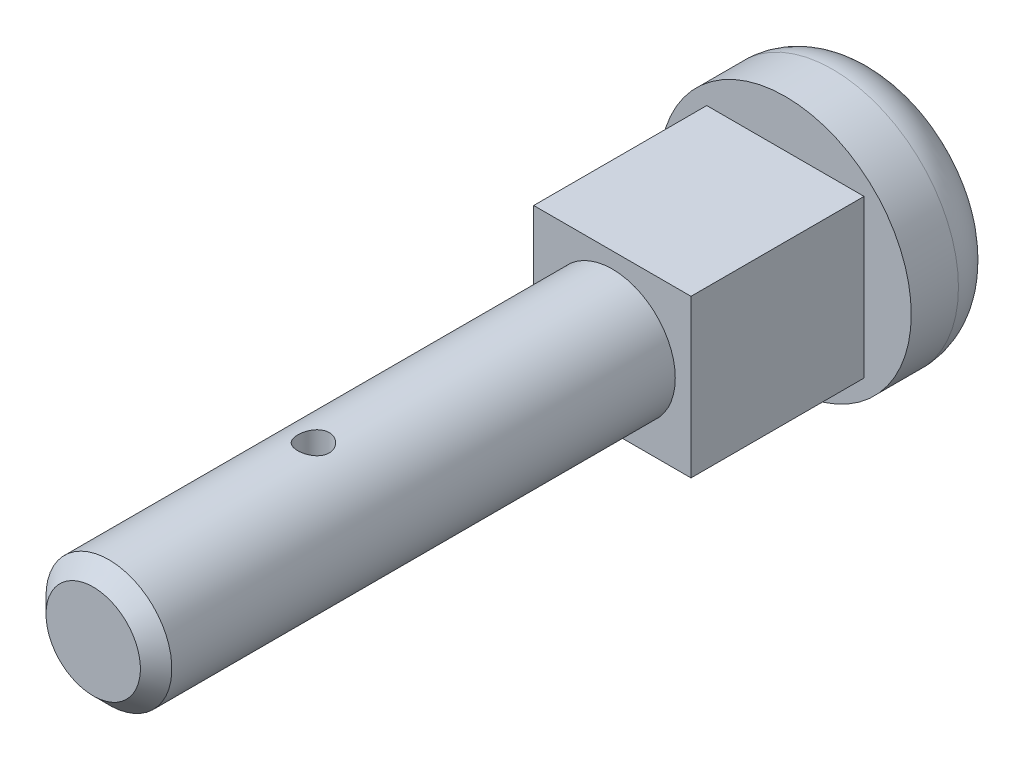
ISO-10303-21;
HEADER;
FILE_DESCRIPTION(('STEP AP214'),'2;1');
FILE_NAME('part.step','',(''),(''),'','','');
FILE_SCHEMA(('AUTOMOTIVE_DESIGN { 1 0 10303 214 1 1 1 1 }'));
ENDSEC;
DATA;
#1=APPLICATION_CONTEXT('core data for automotive mechanical design processes');
#2=APPLICATION_PROTOCOL_DEFINITION('international standard','automotive_design',2000,#1);
#3=PRODUCT_CONTEXT('',#1,'mechanical');
#4=PRODUCT('Part','Part','',(#3));
#5=PRODUCT_RELATED_PRODUCT_CATEGORY('part','',(#4));
#6=PRODUCT_DEFINITION_FORMATION('','',#4);
#7=PRODUCT_DEFINITION_CONTEXT('part definition',#1,'design');
#8=PRODUCT_DEFINITION('design','',#6,#7);
#9=PRODUCT_DEFINITION_SHAPE('','',#8);
#10=(LENGTH_UNIT() NAMED_UNIT(*) SI_UNIT(.MILLI.,.METRE.));
#11=(NAMED_UNIT(*) PLANE_ANGLE_UNIT() SI_UNIT($,.RADIAN.));
#12=(NAMED_UNIT(*) SI_UNIT($,.STERADIAN.) SOLID_ANGLE_UNIT());
#13=UNCERTAINTY_MEASURE_WITH_UNIT(LENGTH_MEASURE(1.E-05),#10,'distance_accuracy_value','');
#14=(GEOMETRIC_REPRESENTATION_CONTEXT(3) GLOBAL_UNCERTAINTY_ASSIGNED_CONTEXT((#13)) GLOBAL_UNIT_ASSIGNED_CONTEXT((#10,
#11,#12)) REPRESENTATION_CONTEXT('',''));
#15=CARTESIAN_POINT('',(0.,0.,0.));
#16=DIRECTION('',(0.,0.,1.));
#17=DIRECTION('',(1.,0.,0.));
#18=AXIS2_PLACEMENT_3D('',#15,#16,#17);
#19=CARTESIAN_POINT('',(0.,0.,-5.99999999999954));
#20=DIRECTION('',(0.,0.,0.999999999999971));
#21=DIRECTION('',(1.,0.,0.));
#22=AXIS2_PLACEMENT_3D('',#19,#20,#21);
#23=CYLINDRICAL_SURFACE('',#22,8.);
#24=CARTESIAN_POINT('',(0.,0.,-2.99999999999977));
#25=DIRECTION('',(0.,0.,0.999999999999971));
#26=DIRECTION('',(1.,0.,0.));
#27=AXIS2_PLACEMENT_3D('',#24,#25,#26);
#28=CIRCLE('',#27,8.);
#29=CARTESIAN_POINT('',(8.00000000000001,0.,-2.99999999999977));
#30=VERTEX_POINT('',#29);
#31=EDGE_CURVE('E186',#30,#30,#28,.T.);
#32=CARTESIAN_POINT('',(0.,0.,0.));
#33=DIRECTION('',(0.,0.,0.999999999999971));
#34=DIRECTION('',(1.,0.,0.));
#35=AXIS2_PLACEMENT_3D('',#32,#33,#34);
#36=CIRCLE('',#35,8.);
#37=CARTESIAN_POINT('',(8.00000000000001,0.,0.));
#38=VERTEX_POINT('',#37);
#39=EDGE_CURVE('E115',#38,#38,#36,.T.);
#40=CARTESIAN_POINT('',(8.00000000000001,0.,-2.99999999999977));
#41=CARTESIAN_POINT('',(8.00000000000001,0.,-2.96874999999977));
#42=CARTESIAN_POINT('',(8.00000000000001,0.,-2.93749999999978));
#43=CARTESIAN_POINT('',(8.00000000000001,0.,-2.87499999999978));
#44=CARTESIAN_POINT('',(8.00000000000001,0.,-2.84374999999978));
#45=CARTESIAN_POINT('',(8.00000000000001,0.,-2.78124999999979));
#46=CARTESIAN_POINT('',(8.00000000000001,0.,-2.74999999999979));
#47=CARTESIAN_POINT('',(8.00000000000001,0.,-2.68749999999979));
#48=CARTESIAN_POINT('',(8.00000000000001,0.,-2.6562499999998));
#49=CARTESIAN_POINT('',(8.00000000000001,0.,-2.5937499999998));
#50=CARTESIAN_POINT('',(8.00000000000001,0.,-2.5624999999998));
#51=CARTESIAN_POINT('',(8.00000000000001,0.,-2.49999999999981));
#52=CARTESIAN_POINT('',(8.00000000000001,0.,-2.46874999999981));
#53=CARTESIAN_POINT('',(8.00000000000001,0.,-2.40624999999982));
#54=CARTESIAN_POINT('',(8.00000000000001,0.,-2.37499999999982));
#55=CARTESIAN_POINT('',(8.00000000000001,0.,-2.31249999999982));
#56=CARTESIAN_POINT('',(8.00000000000001,0.,-2.28124999999983));
#57=CARTESIAN_POINT('',(8.00000000000001,0.,-2.21874999999983));
#58=CARTESIAN_POINT('',(8.00000000000001,0.,-2.18749999999983));
#59=CARTESIAN_POINT('',(8.00000000000001,0.,-2.12499999999984));
#60=CARTESIAN_POINT('',(8.00000000000001,0.,-2.09374999999984));
#61=CARTESIAN_POINT('',(8.00000000000001,0.,-2.03124999999984));
#62=CARTESIAN_POINT('',(8.00000000000001,0.,-1.99999999999985));
#63=CARTESIAN_POINT('',(8.00000000000001,0.,-1.93749999999985));
#64=CARTESIAN_POINT('',(8.00000000000001,0.,-1.90624999999985));
#65=CARTESIAN_POINT('',(8.00000000000001,0.,-1.84374999999986));
#66=CARTESIAN_POINT('',(8.00000000000001,0.,-1.81249999999986));
#67=CARTESIAN_POINT('',(8.00000000000001,0.,-1.74999999999987));
#68=CARTESIAN_POINT('',(8.00000000000001,0.,-1.71874999999987));
#69=CARTESIAN_POINT('',(8.00000000000001,0.,-1.65624999999987));
#70=CARTESIAN_POINT('',(8.00000000000001,0.,-1.62499999999988));
#71=CARTESIAN_POINT('',(8.00000000000001,0.,-1.56249999999988));
#72=CARTESIAN_POINT('',(8.00000000000001,0.,-1.53124999999988));
#73=CARTESIAN_POINT('',(8.00000000000001,0.,-1.46874999999989));
#74=CARTESIAN_POINT('',(8.00000000000001,0.,-1.43749999999989));
#75=CARTESIAN_POINT('',(8.00000000000001,0.,-1.3749999999999));
#76=CARTESIAN_POINT('',(8.00000000000001,0.,-1.3437499999999));
#77=CARTESIAN_POINT('',(8.00000000000001,0.,-1.2812499999999));
#78=CARTESIAN_POINT('',(8.00000000000001,0.,-1.2499999999999));
#79=CARTESIAN_POINT('',(8.00000000000001,0.,-1.18749999999991));
#80=CARTESIAN_POINT('',(8.00000000000001,0.,-1.15624999999991));
#81=CARTESIAN_POINT('',(8.00000000000001,0.,-1.09374999999992));
#82=CARTESIAN_POINT('',(8.00000000000001,0.,-1.06249999999992));
#83=CARTESIAN_POINT('',(8.00000000000001,0.,-0.999999999999924));
#84=CARTESIAN_POINT('',(8.00000000000001,0.,-0.968749999999926));
#85=CARTESIAN_POINT('',(8.00000000000001,0.,-0.906249999999931));
#86=CARTESIAN_POINT('',(8.00000000000001,0.,-0.874999999999933));
#87=CARTESIAN_POINT('',(8.00000000000001,0.,-0.812499999999938));
#88=CARTESIAN_POINT('',(8.00000000000001,0.,-0.78124999999994));
#89=CARTESIAN_POINT('',(8.00000000000001,0.,-0.718749999999945));
#90=CARTESIAN_POINT('',(8.00000000000001,0.,-0.687499999999948));
#91=CARTESIAN_POINT('',(8.00000000000001,0.,-0.624999999999953));
#92=CARTESIAN_POINT('',(8.00000000000001,0.,-0.593749999999955));
#93=CARTESIAN_POINT('',(8.00000000000001,0.,-0.53124999999996));
#94=CARTESIAN_POINT('',(8.00000000000001,0.,-0.499999999999962));
#95=CARTESIAN_POINT('',(8.00000000000001,0.,-0.437499999999967));
#96=CARTESIAN_POINT('',(8.00000000000001,0.,-0.406249999999969));
#97=CARTESIAN_POINT('',(8.00000000000001,0.,-0.343749999999974));
#98=CARTESIAN_POINT('',(8.00000000000001,0.,-0.312499999999976));
#99=CARTESIAN_POINT('',(8.00000000000001,0.,-0.249999999999981));
#100=CARTESIAN_POINT('',(8.00000000000001,0.,-0.218749999999984));
#101=CARTESIAN_POINT('',(8.00000000000001,0.,-0.156249999999989));
#102=CARTESIAN_POINT('',(8.00000000000001,0.,-0.124999999999991));
#103=CARTESIAN_POINT('',(8.00000000000001,0.,-0.0624999999999963));
#104=CARTESIAN_POINT('',(8.00000000000001,0.,-0.0312499999999985));
#105=CARTESIAN_POINT('',(8.00000000000001,0.,0.));
#106=B_SPLINE_CURVE_WITH_KNOTS('',3,(#40,#41,#42,#43,#44,#45,#46,#47,#48,#49,#50,#51,#52,#53,
#54,#55,#56,#57,#58,#59,#60,#61,#62,#63,#64,#65,#66,#67,#68,#69,#70,#71,#72,#73,#74,#75,#76,#77,
#78,#79,#80,#81,#82,#83,#84,#85,#86,#87,#88,#89,#90,#91,#92,#93,#94,#95,#96,#97,#98,#99,#100,
#101,#102,#103,#104,#105),.UNSPECIFIED.,.F.,.F.,(4,2,2,2,2,2,2,2,2,2,2,2,2,2,2,2,2,2,2,2,2,2,2,
2,2,2,2,2,2,2,2,2,4),(0.,0.0937499999999931,0.187499999999986,0.281249999999979,
0.374999999999971,0.468749999999964,0.562499999999957,0.65624999999995,0.749999999999943,
0.843749999999935,0.937499999999928,1.03124999999992,1.12499999999991,1.21874999999991,
1.3124999999999,1.40624999999989,1.49999999999989,1.59374999999988,1.68749999999987,
1.78124999999986,1.87499999999986,1.96874999999985,2.06249999999984,2.15624999999983,
2.24999999999983,2.34374999999982,2.43749999999981,2.53124999999981,2.6249999999998,
2.71874999999979,2.81249999999978,2.90624999999978,2.99999999999977),.UNSPECIFIED.);
#107=EDGE_CURVE('BSEAM49',#30,#38,#106,.T.);
#108=ORIENTED_EDGE('',*,*,#31,.T.);
#109=ORIENTED_EDGE('',*,*,#39,.F.);
#110=ORIENTED_EDGE('',*,*,#107,.T.);
#111=ORIENTED_EDGE('',*,*,#107,.F.);
#112=EDGE_LOOP('',(#108,#110,#109,#111));
#113=FACE_BOUND('',#112,.T.);
#114=ADVANCED_FACE('F49',(#113),#23,.T.);
#115=CARTESIAN_POINT('',(0.,0.,-5.99999999999954));
#116=DIRECTION('',(0.,0.,0.999999999999971));
#117=DIRECTION('',(1.,0.,0.));
#118=AXIS2_PLACEMENT_3D('',#115,#116,#117);
#119=PLANE('',#118);
#120=CARTESIAN_POINT('',(0.,0.,-5.99999999999954));
#121=DIRECTION('',(0.,0.,0.999999999999971));
#122=DIRECTION('',(1.,0.,0.));
#123=AXIS2_PLACEMENT_3D('',#120,#121,#122);
#124=CIRCLE('',#123,5.);
#125=CARTESIAN_POINT('',(5.00000000000001,0.,-5.99999999999954));
#126=VERTEX_POINT('',#125);
#127=EDGE_CURVE('E184',#126,#126,#124,.F.);
#128=ORIENTED_EDGE('',*,*,#127,.T.);
#129=EDGE_LOOP('',(#128));
#130=FACE_BOUND('',#129,.T.);
#131=ADVANCED_FACE('F163',(#130),#119,.F.);
#132=CARTESIAN_POINT('',(0.,0.,0.));
#133=DIRECTION('',(0.,0.,0.999999999999971));
#134=DIRECTION('',(1.,0.,0.));
#135=AXIS2_PLACEMENT_3D('',#132,#133,#134);
#136=PLANE('',#135);
#137=DIRECTION('',(0.,-1.,0.));
#138=VECTOR('',#137,1.);
#139=CARTESIAN_POINT('',(-5.00000000000001,-5.00000000000001,0.));
#140=LINE('',#139,#138);
#141=CARTESIAN_POINT('',(-5.00000000000001,5.,0.));
#142=VERTEX_POINT('',#141);
#143=CARTESIAN_POINT('',(-5.00000000000001,-5.00000000000001,0.));
#144=VERTEX_POINT('',#143);
#145=EDGE_CURVE('E66',#142,#144,#140,.T.);
#146=ORIENTED_EDGE('',*,*,#145,.F.);
#147=DIRECTION('',(-1.,0.,0.));
#148=VECTOR('',#147,1.);
#149=CARTESIAN_POINT('',(5.,5.,0.));
#150=LINE('',#149,#148);
#151=CARTESIAN_POINT('',(5.,5.,0.));
#152=VERTEX_POINT('',#151);
#153=EDGE_CURVE('E70',#152,#142,#150,.T.);
#154=ORIENTED_EDGE('',*,*,#153,.F.);
#155=DIRECTION('',(0.,1.,0.));
#156=VECTOR('',#155,1.);
#157=CARTESIAN_POINT('',(5.,-5.00000000000001,0.));
#158=LINE('',#157,#156);
#159=CARTESIAN_POINT('',(5.,-5.00000000000001,0.));
#160=VERTEX_POINT('',#159);
#161=EDGE_CURVE('E297',#160,#152,#158,.T.);
#162=ORIENTED_EDGE('',*,*,#161,.F.);
#163=DIRECTION('',(1.,0.,0.));
#164=VECTOR('',#163,1.);
#165=CARTESIAN_POINT('',(5.,-5.00000000000001,0.));
#166=LINE('',#165,#164);
#167=EDGE_CURVE('E300',#144,#160,#166,.T.);
#168=ORIENTED_EDGE('',*,*,#167,.F.);
#169=EDGE_LOOP('',(#146,#154,#162,#168));
#170=FACE_BOUND('',#169,.T.);
#171=ORIENTED_EDGE('',*,*,#39,.T.);
#172=EDGE_LOOP('',(#171));
#173=FACE_BOUND('',#172,.T.);
#174=ADVANCED_FACE('F169',(#170,#173),#136,.T.);
#175=CARTESIAN_POINT('',(-5.00000000000001,-5.00000000000001,10.9999999999998));
#176=DIRECTION('',(1.,0.,0.));
#177=DIRECTION('',(0.,0.,-0.999999999999971));
#178=AXIS2_PLACEMENT_3D('',#175,#176,#177);
#179=PLANE('',#178);
#180=ORIENTED_EDGE('',*,*,#145,.T.);
#181=DIRECTION('',(0.,0.,-0.999999999999971));
#182=VECTOR('',#181,1.);
#183=CARTESIAN_POINT('',(-5.00000000000001,-5.00000000000001,10.9999999999998));
#184=LINE('',#183,#182);
#185=CARTESIAN_POINT('',(-5.00000000000001,-5.00000000000001,10.9999999999998));
#186=VERTEX_POINT('',#185);
#187=EDGE_CURVE('E95',#186,#144,#184,.T.);
#188=ORIENTED_EDGE('',*,*,#187,.F.);
#189=DIRECTION('',(0.,-1.,0.));
#190=VECTOR('',#189,1.);
#191=CARTESIAN_POINT('',(-5.00000000000001,-5.00000000000001,10.9999999999998));
#192=LINE('',#191,#190);
#193=CARTESIAN_POINT('',(-5.00000000000001,5.00000000000001,10.9999999999998));
#194=VERTEX_POINT('',#193);
#195=EDGE_CURVE('E102',#194,#186,#192,.T.);
#196=ORIENTED_EDGE('',*,*,#195,.F.);
#197=DIRECTION('',(0.,0.,-0.999999999999971));
#198=VECTOR('',#197,1.);
#199=CARTESIAN_POINT('',(-5.00000000000001,5.00000000000001,10.9999999999998));
#200=LINE('',#199,#198);
#201=EDGE_CURVE('E303',#194,#142,#200,.T.);
#202=ORIENTED_EDGE('',*,*,#201,.T.);
#203=EDGE_LOOP('',(#180,#188,#196,#202));
#204=FACE_BOUND('',#203,.T.);
#205=ADVANCED_FACE('F113',(#204),#179,.F.);
#206=CARTESIAN_POINT('',(5.00000000000001,-5.00000000000001,10.9999999999998));
#207=DIRECTION('',(0.,1.,0.));
#208=DIRECTION('',(-1.,0.,0.));
#209=AXIS2_PLACEMENT_3D('',#206,#207,#208);
#210=PLANE('',#209);
#211=ORIENTED_EDGE('',*,*,#167,.T.);
#212=DIRECTION('',(0.,0.,-0.999999999999971));
#213=VECTOR('',#212,1.);
#214=CARTESIAN_POINT('',(5.00000000000001,-5.00000000000001,10.9999999999998));
#215=LINE('',#214,#213);
#216=CARTESIAN_POINT('',(5.00000000000001,-5.00000000000001,10.9999999999998));
#217=VERTEX_POINT('',#216);
#218=EDGE_CURVE('E97',#217,#160,#215,.T.);
#219=ORIENTED_EDGE('',*,*,#218,.F.);
#220=DIRECTION('',(1.,0.,0.));
#221=VECTOR('',#220,1.);
#222=CARTESIAN_POINT('',(5.00000000000001,-5.00000000000001,10.9999999999998));
#223=LINE('',#222,#221);
#224=EDGE_CURVE('E90',#186,#217,#223,.T.);
#225=ORIENTED_EDGE('',*,*,#224,.F.);
#226=ORIENTED_EDGE('',*,*,#187,.T.);
#227=EDGE_LOOP('',(#211,#219,#225,#226));
#228=FACE_BOUND('',#227,.T.);
#229=ADVANCED_FACE('F93',(#228),#210,.F.);
#230=CARTESIAN_POINT('',(5.00000000000001,-5.00000000000001,10.9999999999998));
#231=DIRECTION('',(-1.,0.,0.));
#232=DIRECTION('',(0.,0.,0.999999999999971));
#233=AXIS2_PLACEMENT_3D('',#230,#231,#232);
#234=PLANE('',#233);
#235=ORIENTED_EDGE('',*,*,#161,.T.);
#236=DIRECTION('',(0.,0.,-0.999999999999971));
#237=VECTOR('',#236,1.);
#238=CARTESIAN_POINT('',(5.00000000000001,5.00000000000001,10.9999999999998));
#239=LINE('',#238,#237);
#240=CARTESIAN_POINT('',(5.00000000000001,5.00000000000001,10.9999999999998));
#241=VERTEX_POINT('',#240);
#242=EDGE_CURVE('E123',#241,#152,#239,.T.);
#243=ORIENTED_EDGE('',*,*,#242,.F.);
#244=DIRECTION('',(0.,1.,0.));
#245=VECTOR('',#244,1.);
#246=CARTESIAN_POINT('',(5.00000000000001,-5.00000000000001,10.9999999999998));
#247=LINE('',#246,#245);
#248=EDGE_CURVE('E101',#217,#241,#247,.T.);
#249=ORIENTED_EDGE('',*,*,#248,.F.);
#250=ORIENTED_EDGE('',*,*,#218,.T.);
#251=EDGE_LOOP('',(#235,#243,#249,#250));
#252=FACE_BOUND('',#251,.T.);
#253=ADVANCED_FACE('F213',(#252),#234,.F.);
#254=CARTESIAN_POINT('',(5.00000000000001,5.00000000000001,10.9999999999998));
#255=DIRECTION('',(0.,-1.,0.));
#256=DIRECTION('',(1.,0.,0.));
#257=AXIS2_PLACEMENT_3D('',#254,#255,#256);
#258=PLANE('',#257);
#259=ORIENTED_EDGE('',*,*,#153,.T.);
#260=ORIENTED_EDGE('',*,*,#201,.F.);
#261=DIRECTION('',(-1.,0.,0.));
#262=VECTOR('',#261,1.);
#263=CARTESIAN_POINT('',(5.00000000000001,5.00000000000001,10.9999999999998));
#264=LINE('',#263,#262);
#265=EDGE_CURVE('E107',#241,#194,#264,.T.);
#266=ORIENTED_EDGE('',*,*,#265,.F.);
#267=ORIENTED_EDGE('',*,*,#242,.T.);
#268=EDGE_LOOP('',(#259,#260,#266,#267));
#269=FACE_BOUND('',#268,.T.);
#270=ADVANCED_FACE('F209',(#269),#258,.F.);
#271=CARTESIAN_POINT('',(0.,0.,10.9999999999998));
#272=DIRECTION('',(0.,0.,0.999999999999971));
#273=DIRECTION('',(1.,0.,0.));
#274=AXIS2_PLACEMENT_3D('',#271,#272,#273);
#275=PLANE('',#274);
#276=CARTESIAN_POINT('',(0.,0.,10.9999999999998));
#277=DIRECTION('',(0.,0.,0.999999999999971));
#278=DIRECTION('',(1.,0.,0.));
#279=AXIS2_PLACEMENT_3D('',#276,#277,#278);
#280=CIRCLE('',#279,4.);
#281=CARTESIAN_POINT('',(4.,0.,10.9999999999998));
#282=VERTEX_POINT('',#281);
#283=EDGE_CURVE('E127',#282,#282,#280,.F.);
#284=ORIENTED_EDGE('',*,*,#283,.T.);
#285=EDGE_LOOP('',(#284));
#286=FACE_BOUND('',#285,.T.);
#287=ORIENTED_EDGE('',*,*,#195,.T.);
#288=ORIENTED_EDGE('',*,*,#224,.T.);
#289=ORIENTED_EDGE('',*,*,#248,.T.);
#290=ORIENTED_EDGE('',*,*,#265,.T.);
#291=EDGE_LOOP('',(#287,#288,#289,#290));
#292=FACE_BOUND('',#291,.T.);
#293=ADVANCED_FACE('F105',(#286,#292),#275,.T.);
#294=CARTESIAN_POINT('',(0.,0.,43.9999999999991));
#295=DIRECTION('',(0.,0.,-0.999999999999971));
#296=DIRECTION('',(-1.,0.,0.));
#297=AXIS2_PLACEMENT_3D('',#294,#295,#296);
#298=CYLINDRICAL_SURFACE('',#297,4.);
#299=CARTESIAN_POINT('',(0.,0.,42.9999999999991));
#300=DIRECTION('',(0.,0.,0.999999999999971));
#301=DIRECTION('',(1.,0.,0.));
#302=AXIS2_PLACEMENT_3D('',#299,#300,#301);
#303=CIRCLE('',#302,4.);
#304=CARTESIAN_POINT('',(-4.00000000000003,0.,42.9999999999991));
#305=VERTEX_POINT('',#304);
#306=EDGE_CURVE('E11',#305,#305,#303,.F.);
#307=ORIENTED_EDGE('',*,*,#306,.T.);
#308=EDGE_LOOP('',(#307));
#309=FACE_BOUND('',#308,.T.);
#310=CARTESIAN_POINT('',(0.,4.,30.9999999999991));
#311=CARTESIAN_POINT('',(-0.0552507257798105,3.99999906578675,30.999998449507));
#312=CARTESIAN_POINT('',(-0.110518771887146,3.99884385421219,30.9954056328165));
#313=CARTESIAN_POINT('',(-0.219470882513675,3.99434742553262,30.9771832324611));
#314=CARTESIAN_POINT('',(-0.273154031247182,3.99100496946646,30.9635485269741));
#315=CARTESIAN_POINT('',(-0.377347248121697,3.98250417554694,30.9277071643579));
#316=CARTESIAN_POINT('',(-0.427861042286569,3.97734801894726,30.9055108008556));
#317=CARTESIAN_POINT('',(-0.524448087936195,3.9657689587173,30.8532124066359));
#318=CARTESIAN_POINT('',(-0.57052118956584,3.95934601236034,30.8231101092533));
#319=CARTESIAN_POINT('',(-0.657867951533941,3.94578275727868,30.7551994735632));
#320=CARTESIAN_POINT('',(-0.699037126707276,3.93863138099024,30.7172589500264));
#321=CARTESIAN_POINT('',(-0.774499284802094,3.92449080078355,30.6350318633932));
#322=CARTESIAN_POINT('',(-0.808791491299409,3.91750161525566,30.5907445847016));
#323=CARTESIAN_POINT('',(-0.870017695199358,3.90436517133141,30.496269848841));
#324=CARTESIAN_POINT('',(-0.896834810616827,3.89823196313739,30.4460045127923));
#325=CARTESIAN_POINT('',(-0.941597939033594,3.88766329874817,30.3415010588937));
#326=CARTESIAN_POINT('',(-0.959545370292864,3.88322757115193,30.2872635777821));
#327=CARTESIAN_POINT('',(-0.985703224536208,3.87666984478367,30.177504334531));
#328=CARTESIAN_POINT('',(-0.994101512222215,3.87450327383618,30.1220300692994));
#329=CARTESIAN_POINT('',(-1.0015078500452,3.87259575025161,30.01042095399));
#330=CARTESIAN_POINT('',(-1.00051742787862,3.87285440299097,29.9542862128669));
#331=CARTESIAN_POINT('',(-0.989324349759535,3.87572803664412,29.844389461503));
#332=CARTESIAN_POINT('',(-0.979345560127069,3.87828575334585,29.7906029190225));
#333=CARTESIAN_POINT('',(-0.950816124602105,3.88537806450988,29.6854926327251));
#334=CARTESIAN_POINT('',(-0.932264868046254,3.88991279980465,29.6341690646467));
#335=CARTESIAN_POINT('',(-0.886926318624768,3.90050075936125,29.5348413224979));
#336=CARTESIAN_POINT('',(-0.860057778155362,3.90656884979612,29.4868758854729));
#337=CARTESIAN_POINT('',(-0.798904184010056,3.91953140564255,29.3960541934947));
#338=CARTESIAN_POINT('',(-0.76461783253922,3.9264260155649,29.3531988346211));
#339=CARTESIAN_POINT('',(-0.688442283120807,3.94050587026521,29.2725309228697));
#340=CARTESIAN_POINT('',(-0.646364172110667,3.94769379651979,29.2348970066249));
#341=CARTESIAN_POINT('',(-0.55640794500257,3.96137310385856,29.1671858383566));
#342=CARTESIAN_POINT('',(-0.508529651805308,3.96786446366277,29.1371088171569));
#343=CARTESIAN_POINT('',(-0.408077259120898,3.97945154729456,29.085299609183));
#344=CARTESIAN_POINT('',(-0.355487595472434,3.9845424008515,29.0635964398295));
#345=CARTESIAN_POINT('',(-0.247250672095295,3.99271944660945,29.0293884628593));
#346=CARTESIAN_POINT('',(-0.191603999433669,3.99580602226188,29.0168818957203));
#347=CARTESIAN_POINT('',(-0.0803599802600112,3.9995699951425,29.0016949562932));
#348=CARTESIAN_POINT('',(-0.0247978133254737,4.00030702338852,28.9987713159489));
#349=CARTESIAN_POINT('',(0.0860219165343337,3.999458698763,29.0021660013694));
#350=CARTESIAN_POINT('',(0.141279506429728,3.99787355494564,29.0084834951985));
#351=CARTESIAN_POINT('',(0.249076179184328,3.99259720751572,29.0299806055933));
#352=CARTESIAN_POINT('',(0.301643412645836,3.98893756123874,29.0450275089837));
#353=CARTESIAN_POINT('',(0.403504861635007,3.97992471089423,29.0834047226847));
#354=CARTESIAN_POINT('',(0.452798746021756,3.97457133579928,29.1067358695412));
#355=CARTESIAN_POINT('',(0.547682089619896,3.96262205284207,29.1614907525822));
#356=CARTESIAN_POINT('',(0.593190294557216,3.95600578244621,29.1930507415969));
#357=CARTESIAN_POINT('',(0.67835107576216,3.94229672791613,29.2631932725304));
#358=CARTESIAN_POINT('',(0.718002639315335,3.93520386167804,29.3017770264104));
#359=CARTESIAN_POINT('',(0.791327045381817,3.92112637973848,29.3860013072287));
#360=CARTESIAN_POINT('',(0.82482924508135,3.91414869458187,29.4317918020007));
#361=CARTESIAN_POINT('',(0.883673839341793,3.90128585584826,29.5284884229762));
#362=CARTESIAN_POINT('',(0.909016596105287,3.89540065378018,29.5793943219723));
#363=CARTESIAN_POINT('',(0.95063428040619,3.88545396489777,29.6846038149411));
#364=CARTESIAN_POINT('',(0.966962931102703,3.88138170194604,29.7388850855618));
#365=CARTESIAN_POINT('',(0.990230439969178,3.87551162726789,29.8495397585918));
#366=CARTESIAN_POINT('',(0.997171351652432,3.87371331813291,29.9059127006874));
#367=CARTESIAN_POINT('',(1.00135906022266,3.87263267469305,30.0174140159026));
#368=CARTESIAN_POINT('',(0.99887859852007,3.87327955152176,30.0725316234156));
#369=CARTESIAN_POINT('',(0.984918185541902,3.87685272671895,30.1815359257777));
#370=CARTESIAN_POINT('',(0.973438415124505,3.87977897927905,30.2354226453415));
#371=CARTESIAN_POINT('',(0.941954212961855,3.88754173788482,30.3401389727094));
#372=CARTESIAN_POINT('',(0.922000936453575,3.89236676824207,30.3909848701592));
#373=CARTESIAN_POINT('',(0.874176609070039,3.90338503816553,30.4886435884749));
#374=CARTESIAN_POINT('',(0.846304460022785,3.90957846747183,30.5354558487904));
#375=CARTESIAN_POINT('',(0.782578499091419,3.92283756175675,30.6250364193338));
#376=CARTESIAN_POINT('',(0.746535441941498,3.92992176554505,30.6676673822817));
#377=CARTESIAN_POINT('',(0.667859580793155,3.94405351497524,30.7463646965293));
#378=CARTESIAN_POINT('',(0.625225214174098,3.95110105151373,30.7824294867411));
#379=CARTESIAN_POINT('',(0.533645057801727,3.96451770431776,30.8476075390422));
#380=CARTESIAN_POINT('',(0.484598948210922,3.97087222243912,30.8765830757801));
#381=CARTESIAN_POINT('',(0.382177373006978,3.98203283316746,30.9258316419594));
#382=CARTESIAN_POINT('',(0.328805042291154,3.98684003466521,30.9461109070981));
#383=CARTESIAN_POINT('',(0.229606835495646,3.99365373043695,30.9743812202188));
#384=CARTESIAN_POINT('',(0.184253447272047,3.9960172336846,30.983967495368));
#385=CARTESIAN_POINT('',(0.0926040476908566,3.99919070154632,30.996777295747));
#386=CARTESIAN_POINT('',(0.046308107495075,4.00000078300596,31.000001299536));
#387=CARTESIAN_POINT('',(0.,4.,30.9999999999991));
#388=B_SPLINE_CURVE_WITH_KNOTS('',3,(#310,#311,#312,#313,#314,#315,#316,#317,#318,#319,#320,
#321,#322,#323,#324,#325,#326,#327,#328,#329,#330,#331,#332,#333,#334,#335,#336,#337,#338,#339,
#340,#341,#342,#343,#344,#345,#346,#347,#348,#349,#350,#351,#352,#353,#354,#355,#356,#357,#358,
#359,#360,#361,#362,#363,#364,#365,#366,#367,#368,#369,#370,#371,#372,#373,#374,#375,#376,#377,
#378,#379,#380,#381,#382,#383,#384,#385,#386,#387),.UNSPECIFIED.,.T.,.F.,(4,2,2,2,2,2,2,2,2,2,2,
2,2,2,2,2,2,2,2,2,2,2,2,2,2,2,2,2,2,2,2,2,2,2,2,2,2,2,4),(0.,0.165582474981241,
0.331258825175879,0.496736601523993,0.662219960112799,0.830762902914165,0.999324863866967,
1.17039098363858,1.34142974112899,1.5090419673294,1.67662692075118,1.84014998004666,
2.00368468977346,2.16887018582574,2.3340846055743,2.50401000646002,2.67394059705489,
2.84445486006072,3.01493649125761,3.18105539299516,3.3471593407516,3.51080183009357,
3.67446084881525,3.84102391710233,4.00761575338678,4.17829672802982,4.3489701249967,
4.51861503076022,4.68822282168269,4.85295853599072,5.01769093970687,5.18144267039628,
5.34521712091265,5.5132638427327,5.68135046513608,5.85248123666389,6.0234890921423,
6.16228161961428,6.30106370695356),.UNSPECIFIED.);
#389=CARTESIAN_POINT('',(0.,4.,30.9999999999991));
#390=VERTEX_POINT('',#389);
#391=EDGE_CURVE('E121',#390,#390,#388,.T.);
#392=ORIENTED_EDGE('',*,*,#391,.T.);
#393=EDGE_LOOP('',(#392));
#394=FACE_BOUND('',#393,.T.);
#395=CARTESIAN_POINT('',(0.,-4.00000000000001,30.9999999999993));
#396=CARTESIAN_POINT('',(0.0552507257798063,-3.99999906578676,30.9999984495072));
#397=CARTESIAN_POINT('',(0.110518771887155,-3.99884385421219,30.9954056328166));
#398=CARTESIAN_POINT('',(0.219470882513672,-3.99434742553262,30.977183232461));
#399=CARTESIAN_POINT('',(0.273154031247154,-3.99100496946646,30.9635485269738));
#400=CARTESIAN_POINT('',(0.377347248121717,-3.98250417554694,30.9277071643577));
#401=CARTESIAN_POINT('',(0.427861042286663,-3.97734801894725,30.9055108008556));
#402=CARTESIAN_POINT('',(0.524448087936279,-3.96576895871729,30.8532124066358));
#403=CARTESIAN_POINT('',(0.57052118956584,-3.95934601236034,30.8231101092531));
#404=CARTESIAN_POINT('',(0.657867951533942,-3.94578275727868,30.755199473563));
#405=CARTESIAN_POINT('',(0.699037126707366,-3.93863138099022,30.7172589500263));
#406=CARTESIAN_POINT('',(0.774499284802187,-3.92449080078353,30.6350318633931));
#407=CARTESIAN_POINT('',(0.808791491299416,-3.91750161525566,30.5907445847014));
#408=CARTESIAN_POINT('',(0.870017695199349,-3.90436517133141,30.4962698488408));
#409=CARTESIAN_POINT('',(0.896834810616892,-3.89823196313737,30.4460045127922));
#410=CARTESIAN_POINT('',(0.94159793903367,-3.88766329874816,30.3415010588935));
#411=CARTESIAN_POINT('',(0.959545370292878,-3.88322757115193,30.2872635777819));
#412=CARTESIAN_POINT('',(0.985703224536186,-3.87666984478368,30.1775043345308));
#413=CARTESIAN_POINT('',(0.994101512222217,-3.87450327383617,30.1220300692992));
#414=CARTESIAN_POINT('',(1.00150785004522,-3.87259575025161,30.0104209539898));
#415=CARTESIAN_POINT('',(1.00051742787864,-3.87285440299097,29.9542862128667));
#416=CARTESIAN_POINT('',(0.989324349759513,-3.87572803664413,29.8443894615028));
#417=CARTESIAN_POINT('',(0.979345560127008,-3.87828575334586,29.7906029190224));
#418=CARTESIAN_POINT('',(0.950816124602067,-3.88537806450989,29.6854926327249));
#419=CARTESIAN_POINT('',(0.932264868046279,-3.88991279980465,29.6341690646464));
#420=CARTESIAN_POINT('',(0.886926318624769,-3.90050075936125,29.5348413224977));
#421=CARTESIAN_POINT('',(0.860057778155276,-3.90656884979614,29.4868758854727));
#422=CARTESIAN_POINT('',(0.79890418400997,-3.91953140564257,29.3960541934945));
#423=CARTESIAN_POINT('',(0.764617832539221,-3.92642601556491,29.3531988346209));
#424=CARTESIAN_POINT('',(0.688442283120806,-3.94050587026522,29.2725309228695));
#425=CARTESIAN_POINT('',(0.646364172110573,-3.94769379651981,29.2348970066249));
#426=CARTESIAN_POINT('',(0.556407945002465,-3.96137310385857,29.1671858383565));
#427=CARTESIAN_POINT('',(0.508529651805288,-3.96786446366278,29.1371088171567));
#428=CARTESIAN_POINT('',(0.408077259120935,-3.97945154729456,29.0852996091828));
#429=CARTESIAN_POINT('',(0.355487595472445,-3.9845424008515,29.0635964398294));
#430=CARTESIAN_POINT('',(0.247250672095283,-3.99271944660945,29.0293884628594));
#431=CARTESIAN_POINT('',(0.19160399943366,-3.99580602226188,29.0168818957206));
#432=CARTESIAN_POINT('',(0.0803599802599965,-3.9995699951425,29.0016949562934));
#433=CARTESIAN_POINT('',(0.02479781332545,-4.00030702338852,28.9987713159489));
#434=CARTESIAN_POINT('',(-0.0860219165343423,-3.999458698763,29.0021660013694));
#435=CARTESIAN_POINT('',(-0.141279506429712,-3.99787355494565,29.0084834951987));
#436=CARTESIAN_POINT('',(-0.249076179184349,-3.99259720751572,29.0299806055936));
#437=CARTESIAN_POINT('',(-0.301643412645917,-3.98893756123873,29.0450275089838));
#438=CARTESIAN_POINT('',(-0.403504861635071,-3.97992471089422,29.0834047226847));
#439=CARTESIAN_POINT('',(-0.452798746021744,-3.97457133579929,29.1067358695414));
#440=CARTESIAN_POINT('',(-0.547682089619907,-3.96262205284207,29.1614907525825));
#441=CARTESIAN_POINT('',(-0.593190294557329,-3.95600578244619,29.193050741597));
#442=CARTESIAN_POINT('',(-0.67835107576227,-3.94229672791611,29.2631932725305));
#443=CARTESIAN_POINT('',(-0.718002639315341,-3.93520386167804,29.3017770264106));
#444=CARTESIAN_POINT('',(-0.791327045381813,-3.92112637973848,29.386001307229));
#445=CARTESIAN_POINT('',(-0.824829245081446,-3.91414869458185,29.4317918020009));
#446=CARTESIAN_POINT('',(-0.883673839341899,-3.90128585584824,29.5284884229764));
#447=CARTESIAN_POINT('',(-0.909016596105303,-3.89540065378018,29.5793943219725));
#448=CARTESIAN_POINT('',(-0.950634280406171,-3.88545396489778,29.6846038149414));
#449=CARTESIAN_POINT('',(-0.966962931102739,-3.88138170194603,29.738885085562));
#450=CARTESIAN_POINT('',(-0.990230439969235,-3.87551162726788,29.849539758592));
#451=CARTESIAN_POINT('',(-0.997171351652455,-3.87371331813291,29.9059127006876));
#452=CARTESIAN_POINT('',(-1.00135906022263,-3.87263267469306,30.0174140159028));
#453=CARTESIAN_POINT('',(-0.99887859852003,-3.87327955152177,30.0725316234158));
#454=CARTESIAN_POINT('',(-0.984918185541885,-3.87685272671896,30.181535925778));
#455=CARTESIAN_POINT('',(-0.973438415124526,-3.87977897927905,30.2354226453418));
#456=CARTESIAN_POINT('',(-0.941954212961837,-3.88754173788483,30.3401389727096));
#457=CARTESIAN_POINT('',(-0.92200093645348,-3.89236676824209,30.3909848701594));
#458=CARTESIAN_POINT('',(-0.874176609069956,-3.90338503816555,30.4886435884751));
#459=CARTESIAN_POINT('',(-0.846304460022791,-3.90957846747183,30.5354558487906));
#460=CARTESIAN_POINT('',(-0.78257849909141,-3.92283756175676,30.625036419334));
#461=CARTESIAN_POINT('',(-0.746535441941381,-3.92992176554507,30.6676673822818));
#462=CARTESIAN_POINT('',(-0.667859580793031,-3.94405351497526,30.7463646965295));
#463=CARTESIAN_POINT('',(-0.625225214174077,-3.95110105151374,30.7824294867413));
#464=CARTESIAN_POINT('',(-0.533645057801726,-3.96451770431776,30.8476075390424));
#465=CARTESIAN_POINT('',(-0.484598948210835,-3.97087222243913,30.8765830757802));
#466=CARTESIAN_POINT('',(-0.382177373006888,-3.98203283316747,30.9258316419595));
#467=CARTESIAN_POINT('',(-0.328805042291145,-3.98684003466522,30.9461109070984));
#468=CARTESIAN_POINT('',(-0.229606835495654,-3.99365373043695,30.974381220219));
#469=CARTESIAN_POINT('',(-0.184253447272016,-3.99601723368461,30.983967495368));
#470=CARTESIAN_POINT('',(-0.0926040476908134,-3.99919070154632,30.996777295747));
#471=CARTESIAN_POINT('',(-0.0463081074950594,-4.00000078300596,31.0000012995361));
#472=CARTESIAN_POINT('',(0.,-4.00000000000001,30.9999999999993));
#473=B_SPLINE_CURVE_WITH_KNOTS('',3,(#395,#396,#397,#398,#399,#400,#401,#402,#403,#404,#405,
#406,#407,#408,#409,#410,#411,#412,#413,#414,#415,#416,#417,#418,#419,#420,#421,#422,#423,#424,
#425,#426,#427,#428,#429,#430,#431,#432,#433,#434,#435,#436,#437,#438,#439,#440,#441,#442,#443,
#444,#445,#446,#447,#448,#449,#450,#451,#452,#453,#454,#455,#456,#457,#458,#459,#460,#461,#462,
#463,#464,#465,#466,#467,#468,#469,#470,#471,#472),.UNSPECIFIED.,.T.,.F.,(4,2,2,2,2,2,2,2,2,2,2,
2,2,2,2,2,2,2,2,2,2,2,2,2,2,2,2,2,2,2,2,2,2,2,2,2,2,2,4),(0.,0.165582474981258,
0.331258825175945,0.496736601524089,0.662219960112895,0.830762902914262,0.999324863867084,
1.17039098363872,1.34142974112912,1.50904196732953,1.67662692075131,1.84014998004678,
2.00368468977358,2.16887018582585,2.33408460557441,2.50401000646013,2.67394059705497,
2.84445486006072,3.01493649125757,3.18105539299515,3.3471593407516,3.51080183009358,
3.67446084881528,3.84102391710238,4.00761575338684,4.17829672802989,4.34897012499678,
4.51861503076031,4.68822282168278,4.85295853599081,5.01769093970695,5.18144267039636,
5.34521712091271,5.51326384273277,5.68135046513613,5.85248123666391,6.0234890921423,
6.16228161961428,6.30106370695353),.UNSPECIFIED.);
#474=CARTESIAN_POINT('',(0.,-4.00000000000001,30.9999999999993));
#475=VERTEX_POINT('',#474);
#476=EDGE_CURVE('E131',#475,#475,#473,.T.);
#477=ORIENTED_EDGE('',*,*,#476,.T.);
#478=EDGE_LOOP('',(#477));
#479=FACE_BOUND('',#478,.T.);
#480=ORIENTED_EDGE('',*,*,#283,.F.);
#481=EDGE_LOOP('',(#480));
#482=FACE_BOUND('',#481,.T.);
#483=ADVANCED_FACE('F144',(#309,#394,#479,#482),#298,.T.);
#484=CARTESIAN_POINT('',(0.,0.,43.9999999999991));
#485=DIRECTION('',(0.,0.,0.999999999999971));
#486=DIRECTION('',(1.,0.,0.));
#487=AXIS2_PLACEMENT_3D('',#484,#485,#486);
#488=PLANE('',#487);
#489=CARTESIAN_POINT('',(0.,0.,43.9999999999991));
#490=DIRECTION('',(0.,0.,0.999999999999971));
#491=DIRECTION('',(1.,0.,0.));
#492=AXIS2_PLACEMENT_3D('',#489,#490,#491);
#493=CIRCLE('',#492,3.);
#494=CARTESIAN_POINT('',(-3.,0.,43.9999999999991));
#495=VERTEX_POINT('',#494);
#496=EDGE_CURVE('E59',#495,#495,#493,.T.);
#497=ORIENTED_EDGE('',*,*,#496,.T.);
#498=EDGE_LOOP('',(#497));
#499=FACE_BOUND('',#498,.T.);
#500=ADVANCED_FACE('F152',(#499),#488,.T.);
#501=CARTESIAN_POINT('',(0.,4.00000000000001,29.9999999999991));
#502=DIRECTION('',(0.,1.,0.));
#503=DIRECTION('',(0.,0.,0.999999999999971));
#504=AXIS2_PLACEMENT_3D('',#501,#502,#503);
#505=CYLINDRICAL_SURFACE('',#504,0.999999999999992);
#506=ORIENTED_EDGE('',*,*,#476,.F.);
#507=EDGE_LOOP('',(#506));
#508=FACE_BOUND('',#507,.T.);
#509=ORIENTED_EDGE('',*,*,#391,.F.);
#510=EDGE_LOOP('',(#509));
#511=FACE_BOUND('',#510,.T.);
#512=ADVANCED_FACE('F148',(#508,#511),#505,.F.);
#513=CARTESIAN_POINT('',(0.,0.,-2.99999999999977));
#514=DIRECTION('',(0.,0.,0.999999999999971));
#515=DIRECTION('',(1.,0.,0.));
#516=AXIS2_PLACEMENT_3D('',#513,#514,#515);
#517=TOROIDAL_SURFACE('',#516,5.,3.);
#518=ORIENTED_EDGE('',*,*,#127,.F.);
#519=EDGE_LOOP('',(#518));
#520=FACE_BOUND('',#519,.T.);
#521=ORIENTED_EDGE('',*,*,#31,.F.);
#522=EDGE_LOOP('',(#521));
#523=FACE_BOUND('',#522,.T.);
#524=ADVANCED_FACE('F151',(#520,#523),#517,.T.);
#525=CARTESIAN_POINT('',(0.,0.,43.9999999999991));
#526=DIRECTION('',(0.,0.,-0.999999999999971));
#527=DIRECTION('',(-1.,0.,0.));
#528=AXIS2_PLACEMENT_3D('',#525,#526,#527);
#529=CONICAL_SURFACE('',#528,3.,0.785398163397443);
#530=CARTESIAN_POINT('',(-4.00000000000003,0.,42.9999999999991));
#531=CARTESIAN_POINT('',(-3.98958333333336,0.,43.0104166666657));
#532=CARTESIAN_POINT('',(-3.97916666666669,0.,43.0208333333324));
#533=CARTESIAN_POINT('',(-3.95833333333336,0.,43.0416666666657));
#534=CARTESIAN_POINT('',(-3.9479166666667,0.,43.0520833333324));
#535=CARTESIAN_POINT('',(-3.92708333333336,0.,43.0729166666657));
#536=CARTESIAN_POINT('',(-3.91666666666669,0.,43.0833333333324));
#537=CARTESIAN_POINT('',(-3.89583333333336,0.,43.1041666666657));
#538=CARTESIAN_POINT('',(-3.88541666666669,0.,43.1145833333324));
#539=CARTESIAN_POINT('',(-3.86458333333336,0.,43.1354166666657));
#540=CARTESIAN_POINT('',(-3.85416666666669,0.,43.1458333333324));
#541=CARTESIAN_POINT('',(-3.83333333333336,0.,43.1666666666657));
#542=CARTESIAN_POINT('',(-3.82291666666669,0.,43.1770833333324));
#543=CARTESIAN_POINT('',(-3.80208333333336,0.,43.1979166666657));
#544=CARTESIAN_POINT('',(-3.79166666666669,0.,43.2083333333324));
#545=CARTESIAN_POINT('',(-3.77083333333335,0.,43.2291666666657));
#546=CARTESIAN_POINT('',(-3.76041666666669,0.,43.2395833333324));
#547=CARTESIAN_POINT('',(-3.73958333333336,0.,43.2604166666657));
#548=CARTESIAN_POINT('',(-3.72916666666669,0.,43.2708333333324));
#549=CARTESIAN_POINT('',(-3.70833333333335,0.,43.2916666666657));
#550=CARTESIAN_POINT('',(-3.69791666666669,0.,43.3020833333324));
#551=CARTESIAN_POINT('',(-3.67708333333335,0.,43.3229166666657));
#552=CARTESIAN_POINT('',(-3.66666666666669,0.,43.3333333333324));
#553=CARTESIAN_POINT('',(-3.64583333333335,0.,43.3541666666657));
#554=CARTESIAN_POINT('',(-3.63541666666668,0.,43.3645833333324));
#555=CARTESIAN_POINT('',(-3.61458333333335,0.,43.3854166666657));
#556=CARTESIAN_POINT('',(-3.60416666666668,0.,43.3958333333324));
#557=CARTESIAN_POINT('',(-3.58333333333335,0.,43.4166666666657));
#558=CARTESIAN_POINT('',(-3.57291666666668,0.,43.4270833333324));
#559=CARTESIAN_POINT('',(-3.55208333333335,0.,43.4479166666657));
#560=CARTESIAN_POINT('',(-3.54166666666668,0.,43.4583333333324));
#561=CARTESIAN_POINT('',(-3.52083333333335,0.,43.4791666666657));
#562=CARTESIAN_POINT('',(-3.51041666666668,0.,43.4895833333324));
#563=CARTESIAN_POINT('',(-3.48958333333335,0.,43.5104166666657));
#564=CARTESIAN_POINT('',(-3.47916666666668,0.,43.5208333333324));
#565=CARTESIAN_POINT('',(-3.45833333333334,0.,43.5416666666657));
#566=CARTESIAN_POINT('',(-3.44791666666668,0.,43.5520833333324));
#567=CARTESIAN_POINT('',(-3.42708333333334,0.,43.5729166666657));
#568=CARTESIAN_POINT('',(-3.41666666666668,0.,43.5833333333324));
#569=CARTESIAN_POINT('',(-3.39583333333334,0.,43.6041666666657));
#570=CARTESIAN_POINT('',(-3.38541666666668,0.,43.6145833333324));
#571=CARTESIAN_POINT('',(-3.36458333333334,0.,43.6354166666657));
#572=CARTESIAN_POINT('',(-3.35416666666667,0.,43.6458333333324));
#573=CARTESIAN_POINT('',(-3.33333333333334,0.,43.6666666666657));
#574=CARTESIAN_POINT('',(-3.32291666666667,0.,43.6770833333324));
#575=CARTESIAN_POINT('',(-3.30208333333334,0.,43.6979166666657));
#576=CARTESIAN_POINT('',(-3.29166666666667,0.,43.7083333333324));
#577=CARTESIAN_POINT('',(-3.27083333333334,0.,43.7291666666657));
#578=CARTESIAN_POINT('',(-3.26041666666667,0.,43.7395833333324));
#579=CARTESIAN_POINT('',(-3.23958333333334,0.,43.7604166666657));
#580=CARTESIAN_POINT('',(-3.22916666666667,0.,43.7708333333324));
#581=CARTESIAN_POINT('',(-3.20833333333334,0.,43.7916666666657));
#582=CARTESIAN_POINT('',(-3.19791666666667,0.,43.8020833333324));
#583=CARTESIAN_POINT('',(-3.17708333333333,0.,43.8229166666657));
#584=CARTESIAN_POINT('',(-3.16666666666667,0.,43.8333333333324));
#585=CARTESIAN_POINT('',(-3.14583333333333,0.,43.8541666666657));
#586=CARTESIAN_POINT('',(-3.13541666666667,0.,43.8645833333324));
#587=CARTESIAN_POINT('',(-3.11458333333333,0.,43.8854166666657));
#588=CARTESIAN_POINT('',(-3.10416666666667,0.,43.8958333333324));
#589=CARTESIAN_POINT('',(-3.08333333333333,0.,43.9166666666657));
#590=CARTESIAN_POINT('',(-3.07291666666666,0.,43.9270833333324));
#591=CARTESIAN_POINT('',(-3.05208333333333,0.,43.9479166666657));
#592=CARTESIAN_POINT('',(-3.04166666666666,0.,43.9583333333324));
#593=CARTESIAN_POINT('',(-3.02083333333333,0.,43.9791666666657));
#594=CARTESIAN_POINT('',(-3.01041666666666,0.,43.9895833333324));
#595=CARTESIAN_POINT('',(-3.,0.,43.9999999999991));
#596=B_SPLINE_CURVE_WITH_KNOTS('',3,(#530,#531,#532,#533,#534,#535,#536,#537,#538,#539,#540,
#541,#542,#543,#544,#545,#546,#547,#548,#549,#550,#551,#552,#553,#554,#555,#556,#557,#558,#559,
#560,#561,#562,#563,#564,#565,#566,#567,#568,#569,#570,#571,#572,#573,#574,#575,#576,#577,#578,
#579,#580,#581,#582,#583,#584,#585,#586,#587,#588,#589,#590,#591,#592,#593,#594,#595),
.UNSPECIFIED.,.F.,.F.,(4,2,2,2,2,2,2,2,2,2,2,2,2,2,2,2,2,2,2,2,2,2,2,2,2,2,2,2,2,2,2,2,4),(0.,
0.044194173824158,0.0883883476483203,0.132582521472478,0.17677669529664,0.220970869120797,
0.26516504294496,0.309359216769118,0.35355339059328,0.397747564417443,0.4419417382416,
0.486135912065763,0.53033008588992,0.574524259714083,0.61871843353824,0.662912607362403,
0.707106781186565,0.751300955010723,0.795495128834885,0.839689302659043,0.883883476483205,
0.928077650307363,0.972271824131525,1.01646599795568,1.06066017177985,1.10485434560401,
1.14904851942817,1.19324269325233,1.23743686707649,1.28163104090065,1.3258252147248,
1.37001938854897,1.41421356237312),.UNSPECIFIED.);
#597=EDGE_CURVE('BSEAM52',#305,#495,#596,.T.);
#598=ORIENTED_EDGE('',*,*,#306,.F.);
#599=ORIENTED_EDGE('',*,*,#496,.F.);
#600=ORIENTED_EDGE('',*,*,#597,.T.);
#601=ORIENTED_EDGE('',*,*,#597,.F.);
#602=EDGE_LOOP('',(#598,#600,#599,#601));
#603=FACE_BOUND('',#602,.T.);
#604=ADVANCED_FACE('F52',(#603),#529,.T.);
#605=CLOSED_SHELL('',(#114,#131,#174,#205,#229,#253,#270,#293,#483,#500,#512,#524,#604));
#606=MANIFOLD_SOLID_BREP('B2',#605);
#607=ADVANCED_BREP_SHAPE_REPRESENTATION('',(#18,#606),#14);
#608=SHAPE_DEFINITION_REPRESENTATION(#9,#607);
ENDSEC;
END-ISO-10303-21;
